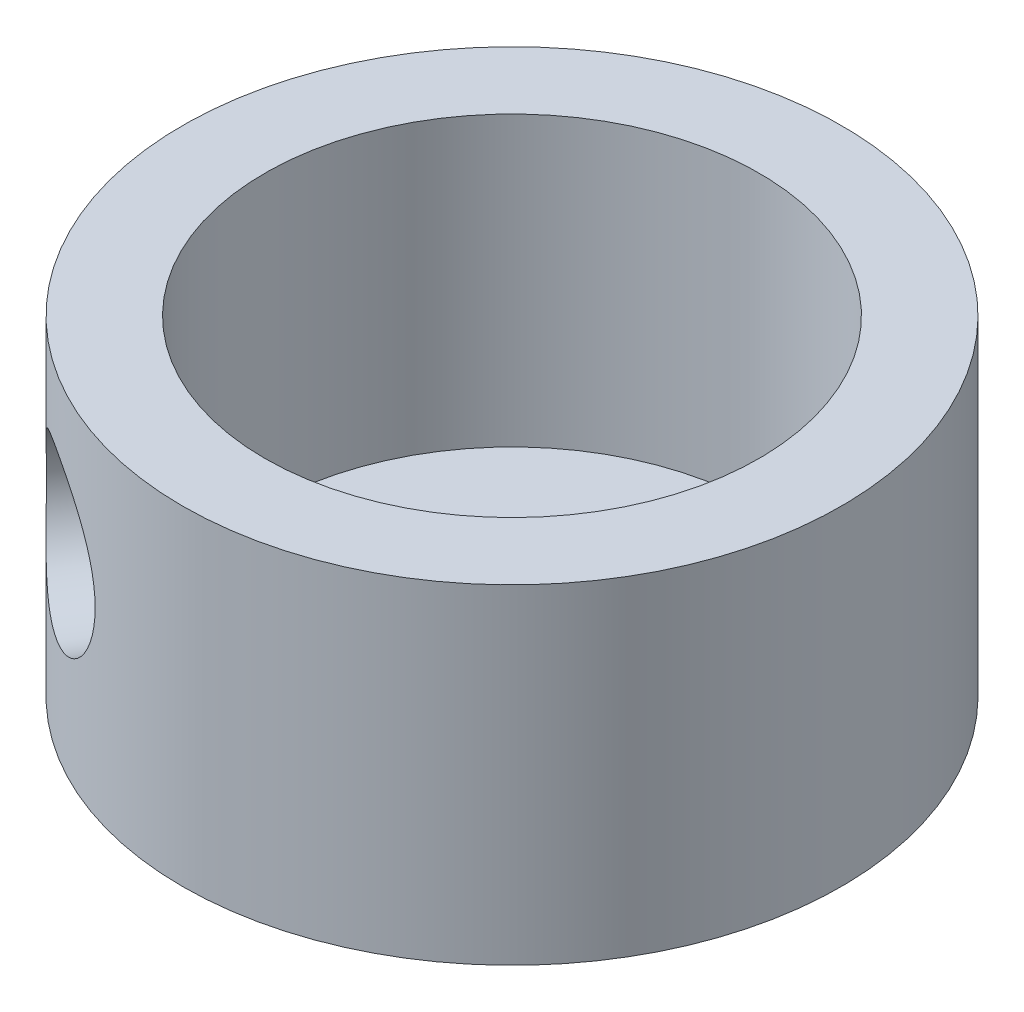
ISO-10303-21;
HEADER;
FILE_DESCRIPTION(('STEP AP214'),'2;1');
FILE_NAME('part.step','',(''),(''),'','','');
FILE_SCHEMA(('AUTOMOTIVE_DESIGN { 1 0 10303 214 1 1 1 1 }'));
ENDSEC;
DATA;
#1=APPLICATION_CONTEXT('core data for automotive mechanical design processes');
#2=APPLICATION_PROTOCOL_DEFINITION('international standard','automotive_design',2000,#1);
#3=PRODUCT_CONTEXT('',#1,'mechanical');
#4=PRODUCT('Part','Part','',(#3));
#5=PRODUCT_RELATED_PRODUCT_CATEGORY('part','',(#4));
#6=PRODUCT_DEFINITION_FORMATION('','',#4);
#7=PRODUCT_DEFINITION_CONTEXT('part definition',#1,'design');
#8=PRODUCT_DEFINITION('design','',#6,#7);
#9=PRODUCT_DEFINITION_SHAPE('','',#8);
#10=(LENGTH_UNIT() NAMED_UNIT(*) SI_UNIT(.MILLI.,.METRE.));
#11=(NAMED_UNIT(*) PLANE_ANGLE_UNIT() SI_UNIT($,.RADIAN.));
#12=(NAMED_UNIT(*) SI_UNIT($,.STERADIAN.) SOLID_ANGLE_UNIT());
#13=UNCERTAINTY_MEASURE_WITH_UNIT(LENGTH_MEASURE(1.E-05),#10,'distance_accuracy_value','');
#14=(GEOMETRIC_REPRESENTATION_CONTEXT(3) GLOBAL_UNCERTAINTY_ASSIGNED_CONTEXT((#13)) GLOBAL_UNIT_ASSIGNED_CONTEXT((#10,
#11,#12)) REPRESENTATION_CONTEXT('',''));
#15=CARTESIAN_POINT('',(0.,0.,0.));
#16=DIRECTION('',(0.,0.,1.));
#17=DIRECTION('',(1.,0.,0.));
#18=AXIS2_PLACEMENT_3D('',#15,#16,#17);
#19=CARTESIAN_POINT('',(0.,40.,0.));
#20=DIRECTION('',(0.,-1.,0.));
#21=DIRECTION('',(0.,0.,-1.));
#22=AXIS2_PLACEMENT_3D('',#19,#20,#21);
#23=CYLINDRICAL_SURFACE('',#22,40.);
#24=CARTESIAN_POINT('',(-12.6609501946875,21.9418173695324,37.9433833516154));
#25=CARTESIAN_POINT('',(-12.6609515770527,21.665692639153,37.9433833234587));
#26=CARTESIAN_POINT('',(-12.6721672581649,21.3895444223222,37.939646083095));
#27=CARTESIAN_POINT('',(-12.716903114546,20.839247782516,37.9246742896226));
#28=CARTESIAN_POINT('',(-12.7504258472098,20.5650995924775,37.9134388768847));
#29=CARTESIAN_POINT('',(-12.8394071267578,20.020667210492,37.8833977877294));
#30=CARTESIAN_POINT('',(-12.894876538165,19.7503850011368,37.8645883617771));
#31=CARTESIAN_POINT('',(-13.0271202154046,19.2157390836277,37.8192942310833));
#32=CARTESIAN_POINT('',(-13.1038950046689,18.9513755210561,37.7928093377696));
#33=CARTESIAN_POINT('',(-13.2777872025523,18.4307460184925,37.7320663255184));
#34=CARTESIAN_POINT('',(-13.3748773671164,18.1744697573803,37.6978186118862));
#35=CARTESIAN_POINT('',(-13.5884410981209,17.6713586098273,37.6213652481628));
#36=CARTESIAN_POINT('',(-13.704914767013,17.4245237732976,37.5791595560095));
#37=CARTESIAN_POINT('',(-13.9560568574548,16.9419389687716,37.4866159268321));
#38=CARTESIAN_POINT('',(-14.0907222943993,16.7061871909845,37.4362793235292));
#39=CARTESIAN_POINT('',(-14.3770280946561,16.2471389364565,37.3272625119569));
#40=CARTESIAN_POINT('',(-14.5286745374555,16.0238469636802,37.2685793134209));
#41=CARTESIAN_POINT('',(-14.8506272017103,15.5869953284089,37.1414780716185));
#42=CARTESIAN_POINT('',(-15.0212389657403,15.3737093996641,37.0728928984072));
#43=CARTESIAN_POINT('',(-15.3771647734157,14.9629209948038,36.9266817632889));
#44=CARTESIAN_POINT('',(-15.5624854937863,14.765425769038,36.8490516881294));
#45=CARTESIAN_POINT('',(-15.9461608690333,14.3876059349536,36.6846494593875));
#46=CARTESIAN_POINT('',(-16.1445167882375,14.2072829963997,36.5978764185041));
#47=CARTESIAN_POINT('',(-16.5524656502643,13.8651245700982,36.4151863814874));
#48=CARTESIAN_POINT('',(-16.7620534656387,13.7032807503622,36.3192735424417));
#49=CARTESIAN_POINT('',(-17.1938982504353,13.3969206256245,36.1168593909166));
#50=CARTESIAN_POINT('',(-17.4162943754469,13.2526879937745,36.0102252805332));
#51=CARTESIAN_POINT('',(-17.8689633034233,12.9854508418394,35.7877593050741));
#52=CARTESIAN_POINT('',(-18.0992330015033,12.8624380669476,35.6719310423664));
#53=CARTESIAN_POINT('',(-18.5658133675226,12.6385297439692,35.4313345284606));
#54=CARTESIAN_POINT('',(-18.8021245594579,12.5376361216566,35.3065655001007));
#55=CARTESIAN_POINT('',(-19.2787828259585,12.3588138671741,35.0485657463421));
#56=CARTESIAN_POINT('',(-19.5191298066617,12.2808847016899,34.9153352175363));
#57=CARTESIAN_POINT('',(-19.9969646760397,12.149998279328,34.6438360571486));
#58=CARTESIAN_POINT('',(-20.2344118587993,12.0965671535932,34.5057241486489));
#59=CARTESIAN_POINT('',(-20.7093777190521,12.0128434042285,34.2227713608912));
#60=CARTESIAN_POINT('',(-20.9468963956367,11.9825504979985,34.0779305638397));
#61=CARTESIAN_POINT('',(-21.4201283891401,11.9453690423955,33.7824791821386));
#62=CARTESIAN_POINT('',(-21.6558419345371,11.9384774805437,33.631869342668));
#63=CARTESIAN_POINT('',(-22.1237135227835,11.9481511471844,33.3259571151814));
#64=CARTESIAN_POINT('',(-22.3558716097521,11.9647160843703,33.1706547854648));
#65=CARTESIAN_POINT('',(-22.8098441099835,12.0205280203286,32.8600817029649));
#66=CARTESIAN_POINT('',(-23.0317737367588,12.0592627313859,32.7048869590797));
#67=CARTESIAN_POINT('',(-23.4691659550711,12.1586956844061,32.3924448432056));
#68=CARTESIAN_POINT('',(-23.6846286586835,12.2193935454976,32.235197506857));
#69=CARTESIAN_POINT('',(-24.1077311101518,12.3622534574491,31.9200076425279));
#70=CARTESIAN_POINT('',(-24.315372004408,12.444412348767,31.7620652202419));
#71=CARTESIAN_POINT('',(-24.7217552556814,12.6295937973663,31.4467961054776));
#72=CARTESIAN_POINT('',(-24.9204942498081,12.7326241594779,31.2894696658442));
#73=CARTESIAN_POINT('',(-25.3096567241534,12.9597582157326,30.9755440903334));
#74=CARTESIAN_POINT('',(-25.4999914644593,13.0840396585571,30.818963589323));
#75=CARTESIAN_POINT('',(-25.8695364138321,13.3521367914535,30.5094279236268));
#76=CARTESIAN_POINT('',(-26.0487461321613,13.495953342351,30.3564729190496));
#77=CARTESIAN_POINT('',(-26.3952549873621,13.8021381810896,30.0556678030324));
#78=CARTESIAN_POINT('',(-26.5625526286433,13.9645087917953,29.9078183338009));
#79=CARTESIAN_POINT('',(-26.8845283852968,14.3067067254352,29.6187264264189));
#80=CARTESIAN_POINT('',(-27.0392062758659,14.486534359217,29.4774841059846));
#81=CARTESIAN_POINT('',(-27.339368065651,14.8675877783498,29.199348484854));
#82=CARTESIAN_POINT('',(-27.4844890926876,15.0692614646169,29.0626768529698));
#83=CARTESIAN_POINT('',(-27.7602378262201,15.4884585487857,28.7994018140028));
#84=CARTESIAN_POINT('',(-27.8908657563348,15.705981702055,28.672798251585));
#85=CARTESIAN_POINT('',(-28.1371835998318,16.1555103496644,28.4311218015994));
#86=CARTESIAN_POINT('',(-28.2528695923591,16.3875196216536,28.3160519423122));
#87=CARTESIAN_POINT('',(-28.4687975272247,16.8643425281015,28.0989503104301));
#88=CARTESIAN_POINT('',(-28.5690454158663,17.1091511837012,27.9969135204768));
#89=CARTESIAN_POINT('',(-28.7542473228167,17.611284109877,27.8066715808451));
#90=CARTESIAN_POINT('',(-28.8391211232567,17.8686656040089,27.7185392725633));
#91=CARTESIAN_POINT('',(-28.9926152180073,18.3929957928945,27.5579500493589));
#92=CARTESIAN_POINT('',(-29.0612354094512,18.6599445481857,27.4854932336445));
#93=CARTESIAN_POINT('',(-29.1819324500588,19.2014434094708,27.3573130191906));
#94=CARTESIAN_POINT('',(-29.2340122005916,19.4759921731469,27.3015866858408));
#95=CARTESIAN_POINT('',(-29.3214226439439,20.0307000038072,27.207688214595));
#96=CARTESIAN_POINT('',(-29.3567537786463,20.3108589225739,27.1695156135755));
#97=CARTESIAN_POINT('',(-29.4098026086399,20.8672071967062,27.1120821113052));
#98=CARTESIAN_POINT('',(-29.4279610563781,21.1433058262523,27.0923481360674));
#99=CARTESIAN_POINT('',(-29.4481797757022,21.696784155545,27.0703700446533));
#100=CARTESIAN_POINT('',(-29.4502403295055,21.9741638327478,27.068125621862));
#101=CARTESIAN_POINT('',(-29.4382552833607,22.5281372978065,27.0811595484312));
#102=CARTESIAN_POINT('',(-29.4242110513705,22.8047311504106,27.0964364095151));
#103=CARTESIAN_POINT('',(-29.3800789611735,23.3551269940867,27.1442814703671));
#104=CARTESIAN_POINT('',(-29.3499911735937,23.6289289974435,27.1768495940157));
#105=CARTESIAN_POINT('',(-29.2745307762248,24.1672540397835,27.2581155233654));
#106=CARTESIAN_POINT('',(-29.2294199452356,24.4318556578512,27.3065368557909));
#107=CARTESIAN_POINT('',(-29.1239641215703,24.9547295100108,27.4189834063276));
#108=CARTESIAN_POINT('',(-29.0636136497967,25.2129994309553,27.4830142362234));
#109=CARTESIAN_POINT('',(-28.9279223049537,25.7213633220489,27.6258031854101));
#110=CARTESIAN_POINT('',(-28.8525831133225,25.9714582056149,27.704559652716));
#111=CARTESIAN_POINT('',(-28.6871795363138,26.4618991659598,27.8757940186602));
#112=CARTESIAN_POINT('',(-28.5971144332281,26.7022447668673,27.968272586063));
#113=CARTESIAN_POINT('',(-28.4006670156384,27.1762693157701,28.1677489773348));
#114=CARTESIAN_POINT('',(-28.2939995117468,27.4097253021176,28.2749958277429));
#115=CARTESIAN_POINT('',(-28.0660618338571,27.8634274102125,28.5012622835646));
#116=CARTESIAN_POINT('',(-27.9447915084603,28.0836733949661,28.6202820110345));
#117=CARTESIAN_POINT('',(-27.6880553395368,28.5095932991503,28.8687286923308));
#118=CARTESIAN_POINT('',(-27.5525872868107,28.7152649424092,28.9981572650665));
#119=CARTESIAN_POINT('',(-27.2679611558041,29.1106878366721,29.2659609249237));
#120=CARTESIAN_POINT('',(-27.1188032271512,29.3004392616376,29.4043359142576));
#121=CARTESIAN_POINT('',(-26.8034158559295,29.6673821260137,29.6921472033875));
#122=CARTESIAN_POINT('',(-26.6368502988517,29.8441350844778,29.8417746452852));
#123=CARTESIAN_POINT('',(-26.2906798269052,30.1783236501723,30.1471956309589));
#124=CARTESIAN_POINT('',(-26.1110796925179,30.3357662831207,30.3029869046862));
#125=CARTESIAN_POINT('',(-25.7395769349667,30.6302912228933,30.6191716861425));
#126=CARTESIAN_POINT('',(-25.5476723379223,30.7673702512322,30.7795659299882));
#127=CARTESIAN_POINT('',(-25.1525518948897,31.020093162318,31.1032851900373));
#128=CARTESIAN_POINT('',(-24.9493362162494,31.1357373620846,31.2666101628564));
#129=CARTESIAN_POINT('',(-24.5342378252972,31.3439057042922,31.5933604380302));
#130=CARTESIAN_POINT('',(-24.3224294382242,31.4365928775904,31.7567762559621));
#131=CARTESIAN_POINT('',(-23.8900265287917,31.5991771520041,32.0833293958048));
#132=CARTESIAN_POINT('',(-23.6694320245054,31.6690742999966,32.2464667182876));
#133=CARTESIAN_POINT('',(-23.2209160612197,31.7854720201093,32.5709326158793));
#134=CARTESIAN_POINT('',(-22.9929957871044,31.8319763557699,32.7322614778553));
#135=CARTESIAN_POINT('',(-22.5313735402672,31.9011953983116,33.0517167945594));
#136=CARTESIAN_POINT('',(-22.297671694417,31.9239106267509,33.2098433194217));
#137=CARTESIAN_POINT('',(-21.8325835947239,31.945060293079,33.5173672177329));
#138=CARTESIAN_POINT('',(-21.6013058486144,31.9441352274792,33.6668850155602));
#139=CARTESIAN_POINT('',(-21.1365764221994,31.9195849998483,33.9605755238257));
#140=CARTESIAN_POINT('',(-20.9031247838526,31.8959602750525,34.1047483371621));
#141=CARTESIAN_POINT('',(-20.4358002484017,31.8262124250821,34.3868079102247));
#142=CARTESIAN_POINT('',(-20.201927366287,31.7800900853013,34.524694889206));
#143=CARTESIAN_POINT('',(-19.7355365205858,31.6657306272854,34.7934050435307));
#144=CARTESIAN_POINT('',(-19.5030185630736,31.597493409981,34.9242281872268));
#145=CARTESIAN_POINT('',(-19.0424312703222,31.4398986089546,35.177471501281));
#146=CARTESIAN_POINT('',(-18.8143443177864,31.3506614009454,35.2999346135471));
#147=CARTESIAN_POINT('',(-18.3629630443423,31.1515152498625,35.5368342096904));
#148=CARTESIAN_POINT('',(-18.1396704891215,31.0415988317176,35.6512677704633));
#149=CARTESIAN_POINT('',(-17.6997128923392,30.8019380932656,35.8717257274395));
#150=CARTESIAN_POINT('',(-17.4830471732379,30.6721958081795,35.9777509851006));
#151=CARTESIAN_POINT('',(-17.0579939172309,30.3937839157805,36.1812157507861));
#152=CARTESIAN_POINT('',(-16.8496067715389,30.2451134153855,36.2786548533262));
#153=CARTESIAN_POINT('',(-16.437876934601,29.9260717243424,36.4670904344127));
#154=CARTESIAN_POINT('',(-16.2347745903871,29.7552660790017,36.5578767200917));
#155=CARTESIAN_POINT('',(-15.8406650002613,29.3960228492928,36.7303636399297));
#156=CARTESIAN_POINT('',(-15.6496579293139,29.2075850099635,36.8120641426711));
#157=CARTESIAN_POINT('',(-15.2813240405915,28.8142691861602,36.9664852764195));
#158=CARTESIAN_POINT('',(-15.1040007341068,28.6093870093588,37.0392036054331));
#159=CARTESIAN_POINT('',(-14.764657833929,28.184556144517,37.1757762527692));
#160=CARTESIAN_POINT('',(-14.6026379393071,27.9646077528878,37.2396307454033));
#161=CARTESIAN_POINT('',(-14.2924787564862,27.5067644441905,37.3597810567465));
#162=CARTESIAN_POINT('',(-14.1446597577701,27.2686088714241,37.4159111717146));
#163=CARTESIAN_POINT('',(-13.8679791858262,26.7798158927381,37.5193412760997));
#164=CARTESIAN_POINT('',(-13.7391106696068,26.5291831034389,37.5666445011895));
#165=CARTESIAN_POINT('',(-13.5016725178047,26.0171950519686,37.6526331564154));
#166=CARTESIAN_POINT('',(-13.3930939378812,25.7558445766918,37.691322385276));
#167=CARTESIAN_POINT('',(-13.1973758298499,25.2241845019987,37.7602973291588));
#168=CARTESIAN_POINT('',(-13.1102330332937,24.9538762755679,37.7905843254124));
#169=CARTESIAN_POINT('',(-12.9727464590411,24.4580902762044,37.8379712661198));
#170=CARTESIAN_POINT('',(-12.918559954972,24.2338032777268,37.8564819248664));
#171=CARTESIAN_POINT('',(-12.8253526032761,23.7817331270211,37.8881612269641));
#172=CARTESIAN_POINT('',(-12.7863306777554,23.5539502244775,37.90133025));
#173=CARTESIAN_POINT('',(-12.7237649526246,23.0960046236912,37.9223799004085));
#174=CARTESIAN_POINT('',(-12.7002225386432,22.8658417142778,37.930260054356));
#175=CARTESIAN_POINT('',(-12.668816622071,22.4043969482686,37.9407611070045));
#176=CARTESIAN_POINT('',(-12.6609490367385,22.1731153987763,37.943383375201));
#177=CARTESIAN_POINT('',(-12.6609501946875,21.9418173695324,37.9433833516154));
#178=B_SPLINE_CURVE_WITH_KNOTS('',3,(#24,#25,#26,#27,#28,#29,#30,#31,#32,#33,#34,#35,#36,#37,
#38,#39,#40,#41,#42,#43,#44,#45,#46,#47,#48,#49,#50,#51,#52,#53,#54,#55,#56,#57,#58,#59,#60,#61,
#62,#63,#64,#65,#66,#67,#68,#69,#70,#71,#72,#73,#74,#75,#76,#77,#78,#79,#80,#81,#82,#83,#84,#85,
#86,#87,#88,#89,#90,#91,#92,#93,#94,#95,#96,#97,#98,#99,#100,#101,#102,#103,#104,#105,#106,#107,
#108,#109,#110,#111,#112,#113,#114,#115,#116,#117,#118,#119,#120,#121,#122,#123,#124,#125,#126,
#127,#128,#129,#130,#131,#132,#133,#134,#135,#136,#137,#138,#139,#140,#141,#142,#143,#144,#145,
#146,#147,#148,#149,#150,#151,#152,#153,#154,#155,#156,#157,#158,#159,#160,#161,#162,#163,#164,
#165,#166,#167,#168,#169,#170,#171,#172,#173,#174,#175,#176,#177),.UNSPECIFIED.,.T.,.F.,(4,2,2,
2,2,2,2,2,2,2,2,2,2,2,2,2,2,2,2,2,2,2,2,2,2,2,2,2,2,2,2,2,2,2,2,2,2,2,2,2,2,2,2,2,2,2,2,2,2,2,2,
2,2,2,2,2,2,2,2,2,2,2,2,2,2,2,2,2,2,2,2,2,2,2,2,2,4),(0.,0.828162825376894,1.65642061195399,
2.48508893479637,3.31377761821726,4.14136202570374,4.96895080753375,5.7964039767771,
6.62415434115288,7.46800303009638,8.31223697591946,9.15655292804183,10.0004866733415,
10.8565959733452,11.7123714806966,12.5682214654157,13.4240515727625,14.2625454893966,
15.1010291648647,15.9394048973841,16.7777702181964,17.5975029902136,18.4172215476144,
19.2368194921193,20.056724490713,20.8838566603857,21.7110252899347,22.5382975900666,
23.3655846236836,24.2152966903925,25.064995644794,25.9149171143108,26.7645103958648,
27.6184163805484,28.4723277693369,29.3260892901699,30.1798282847551,31.0110078576627,
31.84217285886,32.6732672652382,33.5043580130106,34.3216649160701,35.1392660843284,
35.9567755855605,36.7743249422728,37.6078964412196,38.441476583192,39.2751866252888,
40.108887556181,40.9636530981616,41.8181067205346,42.6726977588944,43.5272761569089,
44.3755994984591,45.2239210950745,46.0721061662235,46.9202726411621,47.7454843682623,
48.5706802006537,49.3958472274469,50.2210179508398,51.0415691607351,51.8624175534056,
52.6831817385655,53.5039846638633,54.3444458716784,55.1849192344215,56.0256075526296,
56.8662793359624,57.7228427951378,58.5790916443917,59.4349621414426,60.2907020575396,
60.9845870835282,61.6784227793472,62.3723205745282,63.0660376100849),.UNSPECIFIED.);
#179=CARTESIAN_POINT('',(-12.6609501946875,21.9418173695324,37.9433833516154));
#180=VERTEX_POINT('',#179);
#181=EDGE_CURVE('E47',#180,#180,#178,.T.);
#182=ORIENTED_EDGE('',*,*,#181,.T.);
#183=EDGE_LOOP('',(#182));
#184=FACE_BOUND('',#183,.T.);
#185=CARTESIAN_POINT('',(0.,40.,0.));
#186=DIRECTION('',(0.,1.,0.));
#187=DIRECTION('',(0.,0.,1.));
#188=AXIS2_PLACEMENT_3D('',#185,#186,#187);
#189=CIRCLE('',#188,40.);
#190=CARTESIAN_POINT('',(0.,40.,40.));
#191=VERTEX_POINT('',#190);
#192=EDGE_CURVE('E10',#191,#191,#189,.T.);
#193=ORIENTED_EDGE('',*,*,#192,.F.);
#194=EDGE_LOOP('',(#193));
#195=FACE_BOUND('',#194,.T.);
#196=CARTESIAN_POINT('',(0.,0.,0.));
#197=DIRECTION('',(0.,1.,0.));
#198=DIRECTION('',(0.,0.,1.));
#199=AXIS2_PLACEMENT_3D('',#196,#197,#198);
#200=CIRCLE('',#199,40.);
#201=CARTESIAN_POINT('',(0.,0.,40.));
#202=VERTEX_POINT('',#201);
#203=EDGE_CURVE('E35',#202,#202,#200,.T.);
#204=ORIENTED_EDGE('',*,*,#203,.T.);
#205=EDGE_LOOP('',(#204));
#206=FACE_BOUND('',#205,.T.);
#207=ADVANCED_FACE('F31',(#184,#195,#206),#23,.T.);
#208=CARTESIAN_POINT('',(0.,40.,0.));
#209=DIRECTION('',(0.,1.,0.));
#210=DIRECTION('',(0.,0.,1.));
#211=AXIS2_PLACEMENT_3D('',#208,#209,#210);
#212=PLANE('',#211);
#213=CARTESIAN_POINT('',(0.,40.,0.));
#214=DIRECTION('',(0.,1.,0.));
#215=DIRECTION('',(0.,0.,1.));
#216=AXIS2_PLACEMENT_3D('',#213,#214,#215);
#217=CIRCLE('',#216,30.);
#218=CARTESIAN_POINT('',(0.,40.,30.));
#219=VERTEX_POINT('',#218);
#220=EDGE_CURVE('E44',#219,#219,#217,.T.);
#221=ORIENTED_EDGE('',*,*,#220,.F.);
#222=EDGE_LOOP('',(#221));
#223=FACE_BOUND('',#222,.T.);
#224=ORIENTED_EDGE('',*,*,#192,.T.);
#225=EDGE_LOOP('',(#224));
#226=FACE_BOUND('',#225,.T.);
#227=ADVANCED_FACE('F77',(#223,#226),#212,.T.);
#228=CARTESIAN_POINT('',(0.,0.,0.));
#229=DIRECTION('',(0.,1.,0.));
#230=DIRECTION('',(0.,0.,1.));
#231=AXIS2_PLACEMENT_3D('',#228,#229,#230);
#232=PLANE('',#231);
#233=ORIENTED_EDGE('',*,*,#203,.F.);
#234=EDGE_LOOP('',(#233));
#235=FACE_BOUND('',#234,.T.);
#236=ADVANCED_FACE('F75',(#235),#232,.F.);
#237=CARTESIAN_POINT('',(0.,5.,0.));
#238=DIRECTION('',(0.,1.,0.));
#239=DIRECTION('',(0.,0.,1.));
#240=AXIS2_PLACEMENT_3D('',#237,#238,#239);
#241=CYLINDRICAL_SURFACE('',#240,30.);
#242=CARTESIAN_POINT('',(-6.98254459206651,21.9418173695324,29.1760873151251));
#243=CARTESIAN_POINT('',(-6.98254444807336,22.2141592489808,29.1760873025784));
#244=CARTESIAN_POINT('',(-6.99403444263195,22.4864994708989,29.1733446766507));
#245=CARTESIAN_POINT('',(-7.03983068834251,23.0291375265258,29.1623273387734));
#246=CARTESIAN_POINT('',(-7.07413677485519,23.2994353749579,29.1540526667427));
#247=CARTESIAN_POINT('',(-7.16509354020288,23.8360384155822,29.1318317310516));
#248=CARTESIAN_POINT('',(-7.22174715301546,24.102343078747,29.1178847226702));
#249=CARTESIAN_POINT('',(-7.35664055064036,24.6290398835396,29.0840964460611));
#250=CARTESIAN_POINT('',(-7.43488052105724,24.8894319743087,29.0642551271527));
#251=CARTESIAN_POINT('',(-7.61175954388095,25.4019823545626,29.018432679446));
#252=CARTESIAN_POINT('',(-7.71035343196588,25.6541574665539,28.992465126541));
#253=CARTESIAN_POINT('',(-7.92692038022637,26.1493632436973,28.9340026384338));
#254=CARTESIAN_POINT('',(-8.04490063236029,26.3923904738857,28.9015052798017));
#255=CARTESIAN_POINT('',(-8.29891555882316,26.8677301746072,28.8295926863238));
#256=CARTESIAN_POINT('',(-8.4349495533148,27.1000430481597,28.7901777119518));
#257=CARTESIAN_POINT('',(-8.72369977765659,27.5526369807803,28.7040024556337));
#258=CARTESIAN_POINT('',(-8.87641702526378,27.7729173045753,28.6572417254854));
#259=CARTESIAN_POINT('',(-9.20278623010137,28.20778976624,28.5541421476179));
#260=CARTESIAN_POINT('',(-9.37698906180763,28.421902039226,28.4975221113042));
#261=CARTESIAN_POINT('',(-9.74008318631528,28.8346001045237,28.3754727866349));
#262=CARTESIAN_POINT('',(-9.9289747591793,29.0331856006497,28.3100433302972));
#263=CARTESIAN_POINT('',(-10.3197861634124,29.4136435758957,28.1699326001062));
#264=CARTESIAN_POINT('',(-10.5217082609243,29.5955131345368,28.0952497148971));
#265=CARTESIAN_POINT('',(-10.9368013537675,29.9413248081944,27.9362803830789));
#266=CARTESIAN_POINT('',(-11.1499720128323,30.1052674586717,27.8519942234647));
#267=CARTESIAN_POINT('',(-11.5915315566367,30.4181899913046,27.671190602654));
#268=CARTESIAN_POINT('',(-11.8201736079757,30.5666607327509,27.5744090245933));
#269=CARTESIAN_POINT('',(-12.2853214734141,30.8423295381959,27.3703369198674));
#270=CARTESIAN_POINT('',(-12.521824139958,30.9695359967144,27.2630505668314));
#271=CARTESIAN_POINT('',(-13.0006992585645,31.2016769878727,27.0379696764581));
#272=CARTESIAN_POINT('',(-13.2430717136295,31.3066115091199,26.9201751337457));
#273=CARTESIAN_POINT('',(-13.7315312778477,31.4932488143865,26.6743282546995));
#274=CARTESIAN_POINT('',(-13.9776182274735,31.5749525931302,26.5462763578796));
#275=CARTESIAN_POINT('',(-14.4627238885611,31.7119110554789,26.2850309806268));
#276=CARTESIAN_POINT('',(-14.7016906614165,31.767986998392,26.1521713525779));
#277=CARTESIAN_POINT('',(-15.1790660241434,31.8572229408629,25.8780158458066));
#278=CARTESIAN_POINT('',(-15.4174746256941,31.8903834242515,25.7367201452695));
#279=CARTESIAN_POINT('',(-15.8917337814918,31.9334550390991,25.44661179911));
#280=CARTESIAN_POINT('',(-16.1275848912282,31.9433713241453,25.2978008272117));
#281=CARTESIAN_POINT('',(-16.5949127689839,31.9398689387485,24.9937307350477));
#282=CARTESIAN_POINT('',(-16.8263896381532,31.92645080856,24.8384717641517));
#283=CARTESIAN_POINT('',(-17.2742466449125,31.877401645796,24.5289944720456));
#284=CARTESIAN_POINT('',(-17.490862628718,31.8426638653263,24.3749748386114));
#285=CARTESIAN_POINT('',(-17.9170451280805,31.7520982163988,24.063440373761));
#286=CARTESIAN_POINT('',(-18.126611861186,31.6962709994383,23.9059256504571));
#287=CARTESIAN_POINT('',(-18.5374319292897,31.5640269648638,23.5887887181981));
#288=CARTESIAN_POINT('',(-18.7386864363381,31.4876130615471,23.4291668105801));
#289=CARTESIAN_POINT('',(-19.1319261366832,31.314798586749,23.1091690359041));
#290=CARTESIAN_POINT('',(-19.3239077831315,31.2183904409955,22.9487929056965));
#291=CARTESIAN_POINT('',(-19.7000163603684,31.0050091689878,22.626785581041));
#292=CARTESIAN_POINT('',(-19.8840120078493,30.8877896157343,22.4651644393696));
#293=CARTESIAN_POINT('',(-20.240818643219,30.634477065784,22.1442288006122));
#294=CARTESIAN_POINT('',(-20.4136254725198,30.4983771101338,21.9849151780551));
#295=CARTESIAN_POINT('',(-20.7473939357603,30.2082757130092,21.6702160357277));
#296=CARTESIAN_POINT('',(-20.9083550628181,30.0542735062176,21.5148306842361));
#297=CARTESIAN_POINT('',(-21.2179623234376,29.7293643749707,21.2095579418912));
#298=CARTESIAN_POINT('',(-21.3666080082812,29.5584568350602,21.0596707514764));
#299=CARTESIAN_POINT('',(-21.6579599286885,29.1922985850896,20.760021350435));
#300=CARTESIAN_POINT('',(-21.8000517092645,28.9962784227766,20.6106010759302));
#301=CARTESIAN_POINT('',(-22.0699353667058,28.5881574308393,20.3213452979315));
#302=CARTESIAN_POINT('',(-22.1977331616533,28.3760633177218,20.1815058370921));
#303=CARTESIAN_POINT('',(-22.4389035058332,27.9368927342331,19.9130158215544));
#304=CARTESIAN_POINT('',(-22.5522676353403,27.7098076352389,19.7843718113237));
#305=CARTESIAN_POINT('',(-22.7642118373879,27.2422504362173,19.5401331213291));
#306=CARTESIAN_POINT('',(-22.8627977719646,27.0017836964376,19.4245332718879));
#307=CARTESIAN_POINT('',(-23.0463784930778,26.5052453063661,19.2063810244393));
#308=CARTESIAN_POINT('',(-23.1311514577778,26.2489958498231,19.1040461305777));
#309=CARTESIAN_POINT('',(-23.2850843715287,25.726005939199,18.9161202478611));
#310=CARTESIAN_POINT('',(-23.3542508034121,25.4592698954322,18.830522308584));
#311=CARTESIAN_POINT('',(-23.4768233896096,24.9171369286516,18.677483369203));
#312=CARTESIAN_POINT('',(-23.5302315696223,24.6417411238774,18.6100400354507));
#313=CARTESIAN_POINT('',(-23.621135826845,24.0843407759425,18.494522388183));
#314=CARTESIAN_POINT('',(-23.6586327246943,23.8023365744079,18.4464470757503));
#315=CARTESIAN_POINT('',(-23.7162608860637,23.2467908369092,18.3722908227686));
#316=CARTESIAN_POINT('',(-23.7370994822606,22.9734417340494,18.3453152019116));
#317=CARTESIAN_POINT('',(-23.7640896260156,22.4248124459188,18.3103396592989));
#318=CARTESIAN_POINT('',(-23.77024161487,22.1495323189196,18.3023391673875));
#319=CARTESIAN_POINT('',(-23.7678385092023,21.5991913910073,18.3054597027683));
#320=CARTESIAN_POINT('',(-23.7592858025244,21.3241305617395,18.3165776254882));
#321=CARTESIAN_POINT('',(-23.7275068024436,20.776284864756,18.3577257503221));
#322=CARTESIAN_POINT('',(-23.7042806894494,20.5034999690996,18.3877557199139));
#323=CARTESIAN_POINT('',(-23.6442890765993,19.9716216262836,18.4648282468808));
#324=CARTESIAN_POINT('',(-23.6080199870687,19.7123810708639,18.5112460388551));
#325=CARTESIAN_POINT('',(-23.5219650719758,19.1995668870291,18.6204723208473));
#326=CARTESIAN_POINT('',(-23.4721744579847,18.9459953006839,18.6832866171152));
#327=CARTESIAN_POINT('',(-23.3592230024785,18.4462973227506,18.8243154377326));
#328=CARTESIAN_POINT('',(-23.296065355243,18.2001691684593,18.9025262825039));
#329=CARTESIAN_POINT('',(-23.156490524945,17.7166911449608,19.0732561610416));
#330=CARTESIAN_POINT('',(-23.0800682176776,17.4793447113219,19.1657807227615));
#331=CARTESIAN_POINT('',(-22.9115366120055,17.007618817215,19.3669625108596));
#332=CARTESIAN_POINT('',(-22.8190112179848,16.7735646883896,19.4760340091272));
#333=CARTESIAN_POINT('',(-22.6201786924204,16.3176192080936,19.7066154710375));
#334=CARTESIAN_POINT('',(-22.5138653909776,16.0957333653945,19.8281309980599));
#335=CARTESIAN_POINT('',(-22.2876834847164,15.6654930511635,20.0820333507382));
#336=CARTESIAN_POINT('',(-22.1678143552465,15.4571391038487,20.2144205971085));
#337=CARTESIAN_POINT('',(-21.9147527427454,15.0551566701163,20.4884942623414));
#338=CARTESIAN_POINT('',(-21.7815599509011,14.8615285251935,20.6301808967174));
#339=CARTESIAN_POINT('',(-21.4953610996835,14.4811349875913,20.9283103943431));
#340=CARTESIAN_POINT('',(-21.3417082271754,14.2951548313562,21.0851355289864));
#341=CARTESIAN_POINT('',(-21.0205233635822,13.9419323102573,21.4053496961267));
#342=CARTESIAN_POINT('',(-20.8529963988692,13.7746832106256,21.5687363405346));
#343=CARTESIAN_POINT('',(-20.5044664837976,13.459973180193,21.9003361585482));
#344=CARTESIAN_POINT('',(-20.3234582618845,13.3125200540139,22.0685512042261));
#345=CARTESIAN_POINT('',(-19.9487818685867,13.0386742780475,22.4078096506891));
#346=CARTESIAN_POINT('',(-19.7551190731519,12.9122727650104,22.5788518276697));
#347=CARTESIAN_POINT('',(-19.3572123245273,12.6822478925412,22.920879331827));
#348=CARTESIAN_POINT('',(-19.153043988116,12.5784839871392,23.0918580226784));
#349=CARTESIAN_POINT('',(-18.7340633496526,12.3936369497623,23.4330503337771));
#350=CARTESIAN_POINT('',(-18.5192510356601,12.3125538432315,23.6032639531658));
#351=CARTESIAN_POINT('',(-18.0803422972785,12.1738613400752,23.9411339077422));
#352=CARTESIAN_POINT('',(-17.856248668444,12.1162449310608,24.1087909924451));
#353=CARTESIAN_POINT('',(-17.4002400822412,12.0250316271712,24.4399474152037));
#354=CARTESIAN_POINT('',(-17.1683254620421,11.9914336982224,24.6034469319638));
#355=CARTESIAN_POINT('',(-16.7094617900066,11.9496100814541,24.9172124795265));
#356=CARTESIAN_POINT('',(-16.4827923012028,11.9402652650463,25.0677392316762));
#357=CARTESIAN_POINT('',(-16.0255612929451,11.9437888436583,25.3624793539931));
#358=CARTESIAN_POINT('',(-15.7949999036526,11.956656497252,25.5066929347218));
#359=CARTESIAN_POINT('',(-15.3317489387492,12.0044787250378,25.7878048843404));
#360=CARTESIAN_POINT('',(-15.0990595372029,12.0394315083833,25.9247038453847));
#361=CARTESIAN_POINT('',(-14.6333446854349,12.1310933978542,26.1904008666062));
#362=CARTESIAN_POINT('',(-14.4003192343527,12.1878025597882,26.3191989060021));
#363=CARTESIAN_POINT('',(-13.9395212909973,12.321374923073,26.5660869177521));
#364=CARTESIAN_POINT('',(-13.7117246816967,12.3978984275875,26.6843160585485));
#365=CARTESIAN_POINT('',(-13.2592468639825,12.5708987409033,26.9120149156446));
#366=CARTESIAN_POINT('',(-13.0345667961296,12.6673826592148,27.021481491569));
#367=CARTESIAN_POINT('',(-12.5901310380377,12.8795236728539,27.2313973347467));
#368=CARTESIAN_POINT('',(-12.3703750012459,12.9951794140288,27.3318472380979));
#369=CARTESIAN_POINT('',(-11.9374197195776,13.2448313490389,27.5237004832938));
#370=CARTESIAN_POINT('',(-11.7242209000689,13.378828729639,27.6151032390983));
#371=CARTESIAN_POINT('',(-11.298271056216,13.6695282558888,27.7921610336251));
#372=CARTESIAN_POINT('',(-11.0858273715557,13.82688616861,27.877479123439));
#373=CARTESIAN_POINT('',(-10.6714645554767,14.1592805143261,28.0387103748022));
#374=CARTESIAN_POINT('',(-10.469545635155,14.3343173017022,28.1146233477534));
#375=CARTESIAN_POINT('',(-10.0778539830562,14.7010165376127,28.2573942579499));
#376=CARTESIAN_POINT('',(-9.88808494686899,14.8926840032853,28.3242494469558));
#377=CARTESIAN_POINT('',(-9.52239964718393,15.291439137416,28.4492750854193));
#378=CARTESIAN_POINT('',(-9.34648326543608,15.4985266742147,28.5074456090155));
#379=CARTESIAN_POINT('',(-9.0034558757102,15.9353680710549,28.6176783087722));
#380=CARTESIAN_POINT('',(-8.8369656321145,16.1656937187633,28.6694091620727));
#381=CARTESIAN_POINT('',(-8.52247284607642,16.6401573720741,28.7644649517568));
#382=CARTESIAN_POINT('',(-8.37446341095894,16.8842901784473,28.8077930254296));
#383=CARTESIAN_POINT('',(-8.09852605903778,17.3848750912843,28.8865794724267));
#384=CARTESIAN_POINT('',(-7.97059815771593,17.6413272072453,28.922037839684));
#385=CARTESIAN_POINT('',(-7.736394103005,18.1648147224631,28.985564373866));
#386=CARTESIAN_POINT('',(-7.63011678889066,18.4318495534448,29.0136329369944));
#387=CARTESIAN_POINT('',(-7.44489785407727,18.9623318844731,29.0616970469336));
#388=CARTESIAN_POINT('',(-7.36493795387661,19.2253961603329,29.0820000973524));
#389=CARTESIAN_POINT('',(-7.22706530991253,19.7576307693249,29.1165689636796));
#390=CARTESIAN_POINT('',(-7.1691518004633,20.0268008900529,29.1308349892598));
#391=CARTESIAN_POINT('',(-7.07617582864493,20.5692250464257,29.1535594979092));
#392=CARTESIAN_POINT('',(-7.04110669532685,20.8424778659884,29.1620196764239));
#393=CARTESIAN_POINT('',(-6.99429119618237,21.3910934839672,29.1732835801334));
#394=CARTESIAN_POINT('',(-6.98254473765599,21.6664562739923,29.1760873278108));
#395=CARTESIAN_POINT('',(-6.98254459206651,21.9418173695324,29.1760873151251));
#396=B_SPLINE_CURVE_WITH_KNOTS('',3,(#242,#243,#244,#245,#246,#247,#248,#249,#250,#251,#252,
#253,#254,#255,#256,#257,#258,#259,#260,#261,#262,#263,#264,#265,#266,#267,#268,#269,#270,#271,
#272,#273,#274,#275,#276,#277,#278,#279,#280,#281,#282,#283,#284,#285,#286,#287,#288,#289,#290,
#291,#292,#293,#294,#295,#296,#297,#298,#299,#300,#301,#302,#303,#304,#305,#306,#307,#308,#309,
#310,#311,#312,#313,#314,#315,#316,#317,#318,#319,#320,#321,#322,#323,#324,#325,#326,#327,#328,
#329,#330,#331,#332,#333,#334,#335,#336,#337,#338,#339,#340,#341,#342,#343,#344,#345,#346,#347,
#348,#349,#350,#351,#352,#353,#354,#355,#356,#357,#358,#359,#360,#361,#362,#363,#364,#365,#366,
#367,#368,#369,#370,#371,#372,#373,#374,#375,#376,#377,#378,#379,#380,#381,#382,#383,#384,#385,
#386,#387,#388,#389,#390,#391,#392,#393,#394,#395),.UNSPECIFIED.,.T.,.F.,(4,2,2,2,2,2,2,2,2,2,2,
2,2,2,2,2,2,2,2,2,2,2,2,2,2,2,2,2,2,2,2,2,2,2,2,2,2,2,2,2,2,2,2,2,2,2,2,2,2,2,2,2,2,2,2,2,2,2,2,
2,2,2,2,2,2,2,2,2,2,2,2,2,2,2,2,2,4),(0.,0.81676805960721,1.6335302255385,2.4503996588184,
3.26727611595183,4.0823590813045,4.89774511187015,5.71310044671445,6.52850554988106,
7.37286999592243,8.21725054497378,9.06177833834291,9.90628089953093,10.7730733994815,
11.6395229027308,12.5059728491808,13.3723856892507,14.208656653563,15.0449099605402,
15.8809778400841,16.7170263626666,17.5202339571185,18.3234167408122,19.1264858838399,
19.9298598051697,20.74347212296,21.5573851233426,22.3713329311248,23.1853103823888,
24.0378278398089,24.889991015934,25.7426490367816,26.5949679354003,27.459853568185,
28.3243792700684,29.1887937900586,30.0531637216384,30.8785251225923,31.7038617231671,
32.5290643128742,33.3542567569691,34.1508897973456,34.9478053211232,35.7445306229922,
36.5415643916545,37.3635426098908,38.1858899294866,39.0082690873152,39.8306673105009,
40.6928533438219,41.5547283753545,42.4169422120339,43.2787921126042,44.1351284875122,
44.9914658230858,45.8475470772924,46.7035914722059,47.5193689812692,48.3351192611683,
49.1508034017131,49.9664896346322,50.7690241262023,51.5718449585706,52.3746091098772,
53.1774252272562,54.0098911655819,54.8423737943936,55.6751084453733,56.5078359871349,
57.3734004329108,58.2386410839163,59.1038824019739,59.9690773207395,60.795173483065,
61.6212409519029,62.4470670866299,63.2728899389621),.UNSPECIFIED.);
#397=CARTESIAN_POINT('',(-6.98254459206651,21.9418173695324,29.1760873151251));
#398=VERTEX_POINT('',#397);
#399=EDGE_CURVE('E56',#398,#398,#396,.T.);
#400=ORIENTED_EDGE('',*,*,#399,.T.);
#401=EDGE_LOOP('',(#400));
#402=FACE_BOUND('',#401,.T.);
#403=CARTESIAN_POINT('',(0.,5.,0.));
#404=DIRECTION('',(0.,1.,0.));
#405=DIRECTION('',(0.,0.,1.));
#406=AXIS2_PLACEMENT_3D('',#403,#404,#405);
#407=CIRCLE('',#406,30.);
#408=CARTESIAN_POINT('',(0.,5.,30.));
#409=VERTEX_POINT('',#408);
#410=EDGE_CURVE('E42',#409,#409,#407,.T.);
#411=ORIENTED_EDGE('',*,*,#410,.F.);
#412=EDGE_LOOP('',(#411));
#413=FACE_BOUND('',#412,.T.);
#414=ORIENTED_EDGE('',*,*,#220,.T.);
#415=EDGE_LOOP('',(#414));
#416=FACE_BOUND('',#415,.T.);
#417=ADVANCED_FACE('F71',(#402,#413,#416),#241,.F.);
#418=CARTESIAN_POINT('',(0.,5.,0.));
#419=DIRECTION('',(0.,1.,0.));
#420=DIRECTION('',(0.,0.,1.));
#421=AXIS2_PLACEMENT_3D('',#418,#419,#420);
#422=PLANE('',#421);
#423=ORIENTED_EDGE('',*,*,#410,.T.);
#424=EDGE_LOOP('',(#423));
#425=FACE_BOUND('',#424,.T.);
#426=ADVANCED_FACE('F64',(#425),#422,.T.);
#427=CARTESIAN_POINT('',(-21.7447581507004,21.9418173695324,33.5732854062207));
#428=DIRECTION('',(-0.543618953767509,0.,0.839332135155517));
#429=DIRECTION('',(0.839332135155517,0.,0.543618953767509));
#430=AXIS2_PLACEMENT_3D('',#427,#428,#429);
#431=CYLINDRICAL_SURFACE('',#430,9.99999999999999);
#432=ORIENTED_EDGE('',*,*,#399,.F.);
#433=EDGE_LOOP('',(#432));
#434=FACE_BOUND('',#433,.T.);
#435=ORIENTED_EDGE('',*,*,#181,.F.);
#436=EDGE_LOOP('',(#435));
#437=FACE_BOUND('',#436,.T.);
#438=ADVANCED_FACE('F61',(#434,#437),#431,.F.);
#439=CLOSED_SHELL('',(#207,#227,#236,#417,#426,#438));
#440=MANIFOLD_SOLID_BREP('B2',#439);
#441=ADVANCED_BREP_SHAPE_REPRESENTATION('',(#18,#440),#14);
#442=SHAPE_DEFINITION_REPRESENTATION(#9,#441);
ENDSEC;
END-ISO-10303-21;
